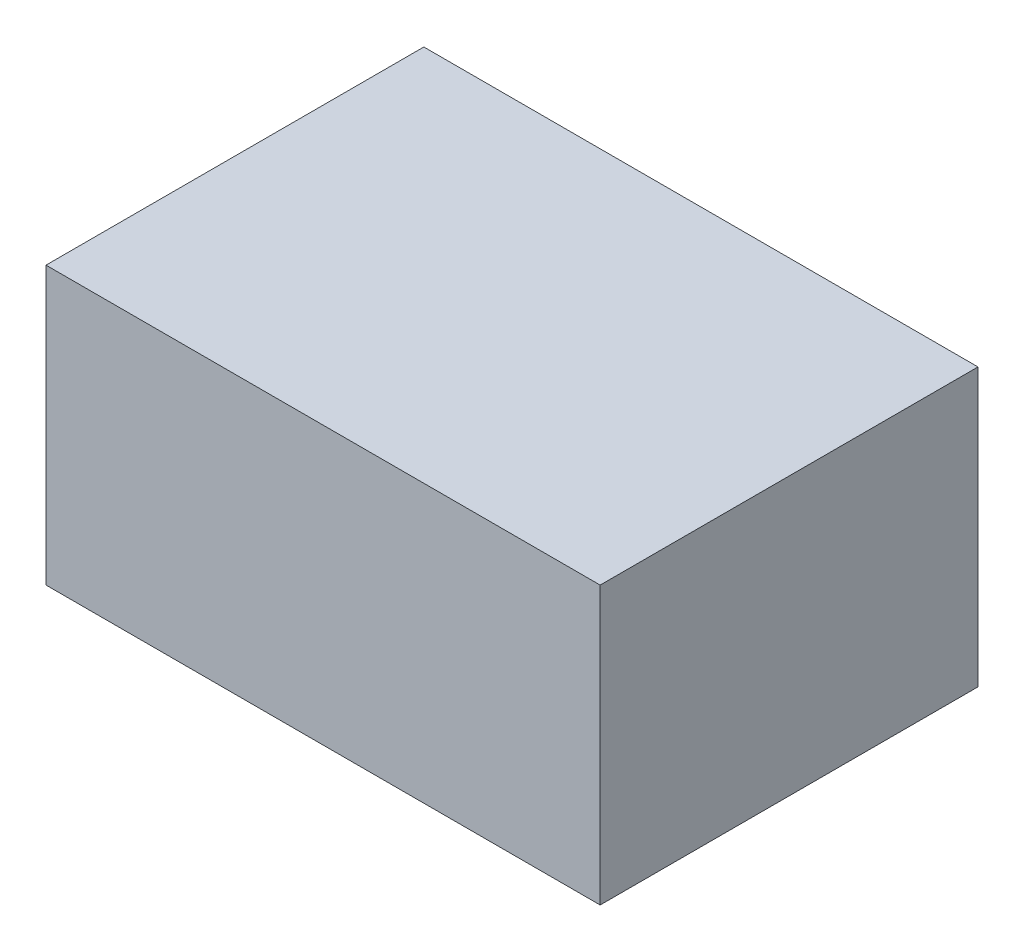
ISO-10303-21;
HEADER;
FILE_DESCRIPTION(('STEP AP214'),'2;1');
FILE_NAME('part.step','',(''),(''),'','','');
FILE_SCHEMA(('AUTOMOTIVE_DESIGN { 1 0 10303 214 1 1 1 1 }'));
ENDSEC;
DATA;
#1=APPLICATION_CONTEXT('core data for automotive mechanical design processes');
#2=APPLICATION_PROTOCOL_DEFINITION('international standard','automotive_design',2000,#1);
#3=PRODUCT_CONTEXT('',#1,'mechanical');
#4=PRODUCT('Part','Part','',(#3));
#5=PRODUCT_RELATED_PRODUCT_CATEGORY('part','',(#4));
#6=PRODUCT_DEFINITION_FORMATION('','',#4);
#7=PRODUCT_DEFINITION_CONTEXT('part definition',#1,'design');
#8=PRODUCT_DEFINITION('design','',#6,#7);
#9=PRODUCT_DEFINITION_SHAPE('','',#8);
#10=(LENGTH_UNIT() NAMED_UNIT(*) SI_UNIT(.MILLI.,.METRE.));
#11=(NAMED_UNIT(*) PLANE_ANGLE_UNIT() SI_UNIT($,.RADIAN.));
#12=(NAMED_UNIT(*) SI_UNIT($,.STERADIAN.) SOLID_ANGLE_UNIT());
#13=UNCERTAINTY_MEASURE_WITH_UNIT(LENGTH_MEASURE(1.E-05),#10,'distance_accuracy_value','');
#14=(GEOMETRIC_REPRESENTATION_CONTEXT(3) GLOBAL_UNCERTAINTY_ASSIGNED_CONTEXT((#13)) GLOBAL_UNIT_ASSIGNED_CONTEXT((#10,
#11,#12)) REPRESENTATION_CONTEXT('',''));
#15=CARTESIAN_POINT('',(0.,0.,0.));
#16=DIRECTION('',(0.,0.,1.));
#17=DIRECTION('',(1.,0.,0.));
#18=AXIS2_PLACEMENT_3D('',#15,#16,#17);
#19=CARTESIAN_POINT('',(0.,0.,190.5));
#20=DIRECTION('',(1.,0.,0.));
#21=DIRECTION('',(0.,0.,-1.));
#22=AXIS2_PLACEMENT_3D('',#19,#20,#21);
#23=PLANE('',#22);
#24=DIRECTION('',(0.,-1.,0.));
#25=VECTOR('',#24,1.);
#26=CARTESIAN_POINT('',(0.,0.,0.));
#27=LINE('',#26,#25);
#28=CARTESIAN_POINT('',(0.,139.7,0.));
#29=VERTEX_POINT('',#28);
#30=CARTESIAN_POINT('',(0.,0.,0.));
#31=VERTEX_POINT('',#30);
#32=EDGE_CURVE('E96',#29,#31,#27,.T.);
#33=ORIENTED_EDGE('',*,*,#32,.T.);
#34=DIRECTION('',(0.,0.,-1.));
#35=VECTOR('',#34,1.);
#36=CARTESIAN_POINT('',(0.,0.,190.5));
#37=LINE('',#36,#35);
#38=CARTESIAN_POINT('',(0.,0.,190.5));
#39=VERTEX_POINT('',#38);
#40=EDGE_CURVE('E11',#39,#31,#37,.T.);
#41=ORIENTED_EDGE('',*,*,#40,.F.);
#42=DIRECTION('',(0.,-1.,0.));
#43=VECTOR('',#42,1.);
#44=CARTESIAN_POINT('',(0.,0.,190.5));
#45=LINE('',#44,#43);
#46=CARTESIAN_POINT('',(0.,139.7,190.5));
#47=VERTEX_POINT('',#46);
#48=EDGE_CURVE('E84',#47,#39,#45,.T.);
#49=ORIENTED_EDGE('',*,*,#48,.F.);
#50=DIRECTION('',(0.,0.,-1.));
#51=VECTOR('',#50,1.);
#52=CARTESIAN_POINT('',(0.,139.7,190.5));
#53=LINE('',#52,#51);
#54=EDGE_CURVE('E92',#47,#29,#53,.T.);
#55=ORIENTED_EDGE('',*,*,#54,.T.);
#56=EDGE_LOOP('',(#33,#41,#49,#55));
#57=FACE_BOUND('',#56,.T.);
#58=ADVANCED_FACE('F33',(#57),#23,.F.);
#59=CARTESIAN_POINT('',(0.,0.,190.5));
#60=DIRECTION('',(0.,1.,0.));
#61=DIRECTION('',(0.,0.,1.));
#62=AXIS2_PLACEMENT_3D('',#59,#60,#61);
#63=PLANE('',#62);
#64=DIRECTION('',(1.,0.,0.));
#65=VECTOR('',#64,1.);
#66=CARTESIAN_POINT('',(0.,0.,0.));
#67=LINE('',#66,#65);
#68=CARTESIAN_POINT('',(279.4,0.,0.));
#69=VERTEX_POINT('',#68);
#70=EDGE_CURVE('E88',#31,#69,#67,.T.);
#71=ORIENTED_EDGE('',*,*,#70,.T.);
#72=DIRECTION('',(0.,0.,-1.));
#73=VECTOR('',#72,1.);
#74=CARTESIAN_POINT('',(279.4,0.,190.5));
#75=LINE('',#74,#73);
#76=CARTESIAN_POINT('',(279.4,0.,190.5));
#77=VERTEX_POINT('',#76);
#78=EDGE_CURVE('E41',#77,#69,#75,.T.);
#79=ORIENTED_EDGE('',*,*,#78,.F.);
#80=DIRECTION('',(1.,0.,0.));
#81=VECTOR('',#80,1.);
#82=CARTESIAN_POINT('',(0.,0.,190.5));
#83=LINE('',#82,#81);
#84=EDGE_CURVE('E79',#39,#77,#83,.T.);
#85=ORIENTED_EDGE('',*,*,#84,.F.);
#86=ORIENTED_EDGE('',*,*,#40,.T.);
#87=EDGE_LOOP('',(#71,#79,#85,#86));
#88=FACE_BOUND('',#87,.T.);
#89=ADVANCED_FACE('F87',(#88),#63,.F.);
#90=CARTESIAN_POINT('',(279.4,0.,190.5));
#91=DIRECTION('',(-1.,0.,0.));
#92=DIRECTION('',(0.,0.,1.));
#93=AXIS2_PLACEMENT_3D('',#90,#91,#92);
#94=PLANE('',#93);
#95=DIRECTION('',(0.,1.,0.));
#96=VECTOR('',#95,1.);
#97=CARTESIAN_POINT('',(279.4,0.,0.));
#98=LINE('',#97,#96);
#99=CARTESIAN_POINT('',(279.4,139.7,0.));
#100=VERTEX_POINT('',#99);
#101=EDGE_CURVE('E66',#69,#100,#98,.T.);
#102=ORIENTED_EDGE('',*,*,#101,.T.);
#103=DIRECTION('',(0.,0.,-1.));
#104=VECTOR('',#103,1.);
#105=CARTESIAN_POINT('',(279.4,139.7,190.5));
#106=LINE('',#105,#104);
#107=CARTESIAN_POINT('',(279.4,139.7,190.5));
#108=VERTEX_POINT('',#107);
#109=EDGE_CURVE('E89',#108,#100,#106,.T.);
#110=ORIENTED_EDGE('',*,*,#109,.F.);
#111=DIRECTION('',(0.,1.,0.));
#112=VECTOR('',#111,1.);
#113=CARTESIAN_POINT('',(279.4,0.,190.5));
#114=LINE('',#113,#112);
#115=EDGE_CURVE('E82',#77,#108,#114,.T.);
#116=ORIENTED_EDGE('',*,*,#115,.F.);
#117=ORIENTED_EDGE('',*,*,#78,.T.);
#118=EDGE_LOOP('',(#102,#110,#116,#117));
#119=FACE_BOUND('',#118,.T.);
#120=ADVANCED_FACE('F90',(#119),#94,.F.);
#121=CARTESIAN_POINT('',(0.,139.7,190.5));
#122=DIRECTION('',(0.,-1.,0.));
#123=DIRECTION('',(0.,0.,-1.));
#124=AXIS2_PLACEMENT_3D('',#121,#122,#123);
#125=PLANE('',#124);
#126=DIRECTION('',(-1.,0.,0.));
#127=VECTOR('',#126,1.);
#128=CARTESIAN_POINT('',(0.,139.7,0.));
#129=LINE('',#128,#127);
#130=EDGE_CURVE('E72',#100,#29,#129,.T.);
#131=ORIENTED_EDGE('',*,*,#130,.T.);
#132=ORIENTED_EDGE('',*,*,#54,.F.);
#133=DIRECTION('',(-1.,0.,0.));
#134=VECTOR('',#133,1.);
#135=CARTESIAN_POINT('',(0.,139.7,190.5));
#136=LINE('',#135,#134);
#137=EDGE_CURVE('E49',#108,#47,#136,.T.);
#138=ORIENTED_EDGE('',*,*,#137,.F.);
#139=ORIENTED_EDGE('',*,*,#109,.T.);
#140=EDGE_LOOP('',(#131,#132,#138,#139));
#141=FACE_BOUND('',#140,.T.);
#142=ADVANCED_FACE('F103',(#141),#125,.F.);
#143=CARTESIAN_POINT('',(0.,0.,190.5));
#144=DIRECTION('',(0.,0.,-1.));
#145=DIRECTION('',(-1.,0.,0.));
#146=AXIS2_PLACEMENT_3D('',#143,#144,#145);
#147=PLANE('',#146);
#148=ORIENTED_EDGE('',*,*,#48,.T.);
#149=ORIENTED_EDGE('',*,*,#84,.T.);
#150=ORIENTED_EDGE('',*,*,#115,.T.);
#151=ORIENTED_EDGE('',*,*,#137,.T.);
#152=EDGE_LOOP('',(#148,#149,#150,#151));
#153=FACE_BOUND('',#152,.T.);
#154=ADVANCED_FACE('F80',(#153),#147,.F.);
#155=CARTESIAN_POINT('',(0.,0.,0.));
#156=DIRECTION('',(0.,0.,-1.));
#157=DIRECTION('',(-1.,0.,0.));
#158=AXIS2_PLACEMENT_3D('',#155,#156,#157);
#159=PLANE('',#158);
#160=ORIENTED_EDGE('',*,*,#32,.F.);
#161=ORIENTED_EDGE('',*,*,#130,.F.);
#162=ORIENTED_EDGE('',*,*,#101,.F.);
#163=ORIENTED_EDGE('',*,*,#70,.F.);
#164=EDGE_LOOP('',(#160,#161,#162,#163));
#165=FACE_BOUND('',#164,.T.);
#166=ADVANCED_FACE('F106',(#165),#159,.T.);
#167=CLOSED_SHELL('',(#58,#89,#120,#142,#154,#166));
#168=MANIFOLD_SOLID_BREP('B2',#167);
#169=ADVANCED_BREP_SHAPE_REPRESENTATION('',(#18,#168),#14);
#170=SHAPE_DEFINITION_REPRESENTATION(#9,#169);
ENDSEC;
END-ISO-10303-21;
